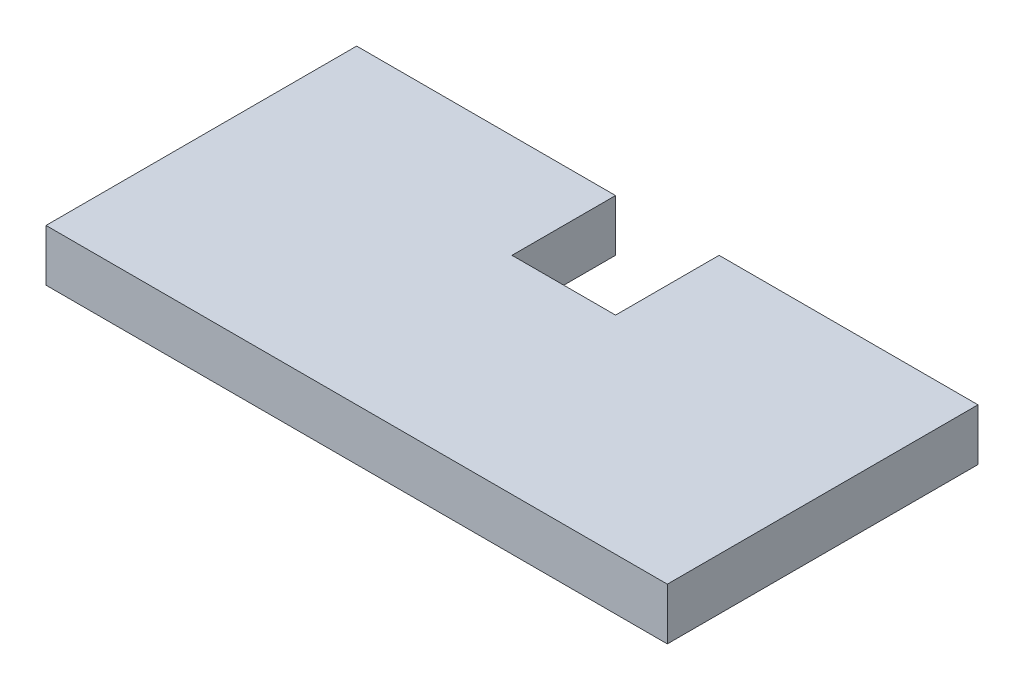
ISO-10303-21;
HEADER;
FILE_DESCRIPTION(('STEP AP214'),'2;1');
FILE_NAME('part.step','',(''),(''),'','','');
FILE_SCHEMA(('AUTOMOTIVE_DESIGN { 1 0 10303 214 1 1 1 1 }'));
ENDSEC;
DATA;
#1=APPLICATION_CONTEXT('core data for automotive mechanical design processes');
#2=APPLICATION_PROTOCOL_DEFINITION('international standard','automotive_design',2000,#1);
#3=PRODUCT_CONTEXT('',#1,'mechanical');
#4=PRODUCT('Part','Part','',(#3));
#5=PRODUCT_RELATED_PRODUCT_CATEGORY('part','',(#4));
#6=PRODUCT_DEFINITION_FORMATION('','',#4);
#7=PRODUCT_DEFINITION_CONTEXT('part definition',#1,'design');
#8=PRODUCT_DEFINITION('design','',#6,#7);
#9=PRODUCT_DEFINITION_SHAPE('','',#8);
#10=(LENGTH_UNIT() NAMED_UNIT(*) SI_UNIT(.MILLI.,.METRE.));
#11=(NAMED_UNIT(*) PLANE_ANGLE_UNIT() SI_UNIT($,.RADIAN.));
#12=(NAMED_UNIT(*) SI_UNIT($,.STERADIAN.) SOLID_ANGLE_UNIT());
#13=UNCERTAINTY_MEASURE_WITH_UNIT(LENGTH_MEASURE(1.E-05),#10,'distance_accuracy_value','');
#14=(GEOMETRIC_REPRESENTATION_CONTEXT(3) GLOBAL_UNCERTAINTY_ASSIGNED_CONTEXT((#13)) GLOBAL_UNIT_ASSIGNED_CONTEXT((#10,
#11,#12)) REPRESENTATION_CONTEXT('',''));
#15=CARTESIAN_POINT('',(0.,0.,0.));
#16=DIRECTION('',(0.,0.,1.));
#17=DIRECTION('',(1.,0.,0.));
#18=AXIS2_PLACEMENT_3D('',#15,#16,#17);
#19=CARTESIAN_POINT('',(-516.052613815904,50.,-370.540919523258));
#20=DIRECTION('',(0.,0.,-1.));
#21=DIRECTION('',(-1.,0.,0.));
#22=AXIS2_PLACEMENT_3D('',#19,#20,#21);
#23=PLANE('',#22);
#24=DIRECTION('',(1.,0.,0.));
#25=VECTOR('',#24,1.);
#26=CARTESIAN_POINT('',(-516.052613815904,50.,-370.540919523258));
#27=LINE('',#26,#25);
#28=CARTESIAN_POINT('',(-516.052613815904,50.,-370.540919523258));
#29=VERTEX_POINT('',#28);
#30=CARTESIAN_POINT('',(-266.052613815904,50.,-370.540919523258));
#31=VERTEX_POINT('',#30);
#32=EDGE_CURVE('E149',#29,#31,#27,.T.);
#33=ORIENTED_EDGE('',*,*,#32,.T.);
#34=DIRECTION('',(0.,-1.,0.));
#35=VECTOR('',#34,1.);
#36=CARTESIAN_POINT('',(-266.052613815904,50.,-370.540919523258));
#37=LINE('',#36,#35);
#38=CARTESIAN_POINT('',(-266.052613815904,0.,-370.540919523258));
#39=VERTEX_POINT('',#38);
#40=EDGE_CURVE('E119',#31,#39,#37,.T.);
#41=ORIENTED_EDGE('',*,*,#40,.T.);
#42=DIRECTION('',(1.,0.,0.));
#43=VECTOR('',#42,1.);
#44=CARTESIAN_POINT('',(-516.052613815904,0.,-370.540919523258));
#45=LINE('',#44,#43);
#46=CARTESIAN_POINT('',(-516.052613815904,0.,-370.540919523258));
#47=VERTEX_POINT('',#46);
#48=EDGE_CURVE('E143',#47,#39,#45,.T.);
#49=ORIENTED_EDGE('',*,*,#48,.F.);
#50=DIRECTION('',(0.,-1.,0.));
#51=VECTOR('',#50,1.);
#52=CARTESIAN_POINT('',(-516.052613815904,50.,-370.540919523258));
#53=LINE('',#52,#51);
#54=EDGE_CURVE('E58',#29,#47,#53,.T.);
#55=ORIENTED_EDGE('',*,*,#54,.F.);
#56=EDGE_LOOP('',(#33,#41,#49,#55));
#57=FACE_BOUND('',#56,.T.);
#58=ADVANCED_FACE('F34',(#57),#23,.T.);
#59=CARTESIAN_POINT('',(0.,50.,0.));
#60=DIRECTION('',(0.,1.,0.));
#61=DIRECTION('',(0.,0.,1.));
#62=AXIS2_PLACEMENT_3D('',#59,#60,#61);
#63=PLANE('',#62);
#64=DIRECTION('',(-1.,0.,0.));
#65=VECTOR('',#64,1.);
#66=CARTESIAN_POINT('',(-166.052613815904,50.,-270.540919523258));
#67=LINE('',#66,#65);
#68=CARTESIAN_POINT('',(-166.052613815904,50.,-270.540919523258));
#69=VERTEX_POINT('',#68);
#70=CARTESIAN_POINT('',(-266.052613815904,50.,-270.540919523258));
#71=VERTEX_POINT('',#70);
#72=EDGE_CURVE('E109',#69,#71,#67,.T.);
#73=ORIENTED_EDGE('',*,*,#72,.T.);
#74=DIRECTION('',(0.,0.,-1.));
#75=VECTOR('',#74,1.);
#76=CARTESIAN_POINT('',(-266.052613815904,50.,-270.540919523258));
#77=LINE('',#76,#75);
#78=EDGE_CURVE('E116',#71,#31,#77,.T.);
#79=ORIENTED_EDGE('',*,*,#78,.T.);
#80=ORIENTED_EDGE('',*,*,#32,.F.);
#81=DIRECTION('',(0.,0.,1.));
#82=VECTOR('',#81,1.);
#83=CARTESIAN_POINT('',(-516.052613815904,50.,-370.540919523258));
#84=LINE('',#83,#82);
#85=CARTESIAN_POINT('',(-516.052613815904,50.,-70.5409195232582));
#86=VERTEX_POINT('',#85);
#87=EDGE_CURVE('E141',#29,#86,#84,.T.);
#88=ORIENTED_EDGE('',*,*,#87,.T.);
#89=DIRECTION('',(1.,0.,0.));
#90=VECTOR('',#89,1.);
#91=CARTESIAN_POINT('',(-516.052613815904,50.,-70.5409195232582));
#92=LINE('',#91,#90);
#93=CARTESIAN_POINT('',(83.9473861840964,50.,-70.5409195232582));
#94=VERTEX_POINT('',#93);
#95=EDGE_CURVE('E84',#86,#94,#92,.T.);
#96=ORIENTED_EDGE('',*,*,#95,.T.);
#97=DIRECTION('',(0.,0.,1.));
#98=VECTOR('',#97,1.);
#99=CARTESIAN_POINT('',(83.9473861840964,50.,-370.540919523258));
#100=LINE('',#99,#98);
#101=CARTESIAN_POINT('',(83.9473861840964,50.,-370.540919523258));
#102=VERTEX_POINT('',#101);
#103=EDGE_CURVE('E145',#102,#94,#100,.T.);
#104=ORIENTED_EDGE('',*,*,#103,.F.);
#105=CARTESIAN_POINT('',(-166.052613815904,50.,-370.540919523258));
#106=VERTEX_POINT('',#105);
#107=EDGE_CURVE('E148',#106,#102,#27,.T.);
#108=ORIENTED_EDGE('',*,*,#107,.F.);
#109=DIRECTION('',(0.,0.,-1.));
#110=VECTOR('',#109,1.);
#111=CARTESIAN_POINT('',(-166.052613815904,50.,-270.540919523258));
#112=LINE('',#111,#110);
#113=EDGE_CURVE('E128',#69,#106,#112,.T.);
#114=ORIENTED_EDGE('',*,*,#113,.F.);
#115=EDGE_LOOP('',(#73,#79,#80,#88,#96,#104,#108,#114));
#116=FACE_BOUND('',#115,.T.);
#117=ADVANCED_FACE('F126',(#116),#63,.T.);
#118=CARTESIAN_POINT('',(0.,0.,0.));
#119=DIRECTION('',(0.,1.,0.));
#120=DIRECTION('',(0.,0.,1.));
#121=AXIS2_PLACEMENT_3D('',#118,#119,#120);
#122=PLANE('',#121);
#123=DIRECTION('',(0.,0.,-1.));
#124=VECTOR('',#123,1.);
#125=CARTESIAN_POINT('',(-266.052613815904,0.,-270.540919523258));
#126=LINE('',#125,#124);
#127=CARTESIAN_POINT('',(-266.052613815904,0.,-270.540919523258));
#128=VERTEX_POINT('',#127);
#129=EDGE_CURVE('E123',#128,#39,#126,.T.);
#130=ORIENTED_EDGE('',*,*,#129,.F.);
#131=DIRECTION('',(-1.,0.,0.));
#132=VECTOR('',#131,1.);
#133=CARTESIAN_POINT('',(-166.052613815904,0.,-270.540919523258));
#134=LINE('',#133,#132);
#135=CARTESIAN_POINT('',(-166.052613815904,0.,-270.540919523258));
#136=VERTEX_POINT('',#135);
#137=EDGE_CURVE('E111',#136,#128,#134,.T.);
#138=ORIENTED_EDGE('',*,*,#137,.F.);
#139=DIRECTION('',(0.,0.,-1.));
#140=VECTOR('',#139,1.);
#141=CARTESIAN_POINT('',(-166.052613815904,0.,-270.540919523258));
#142=LINE('',#141,#140);
#143=CARTESIAN_POINT('',(-166.052613815904,0.,-370.540919523258));
#144=VERTEX_POINT('',#143);
#145=EDGE_CURVE('E137',#136,#144,#142,.T.);
#146=ORIENTED_EDGE('',*,*,#145,.T.);
#147=CARTESIAN_POINT('',(83.9473861840964,0.,-370.540919523258));
#148=VERTEX_POINT('',#147);
#149=EDGE_CURVE('E158',#144,#148,#45,.T.);
#150=ORIENTED_EDGE('',*,*,#149,.T.);
#151=DIRECTION('',(0.,0.,1.));
#152=VECTOR('',#151,1.);
#153=CARTESIAN_POINT('',(83.9473861840964,0.,-370.540919523258));
#154=LINE('',#153,#152);
#155=CARTESIAN_POINT('',(83.9473861840964,0.,-70.5409195232582));
#156=VERTEX_POINT('',#155);
#157=EDGE_CURVE('E155',#148,#156,#154,.T.);
#158=ORIENTED_EDGE('',*,*,#157,.T.);
#159=DIRECTION('',(1.,0.,0.));
#160=VECTOR('',#159,1.);
#161=CARTESIAN_POINT('',(-516.052613815904,0.,-70.5409195232582));
#162=LINE('',#161,#160);
#163=CARTESIAN_POINT('',(-516.052613815904,0.,-70.5409195232582));
#164=VERTEX_POINT('',#163);
#165=EDGE_CURVE('E152',#164,#156,#162,.T.);
#166=ORIENTED_EDGE('',*,*,#165,.F.);
#167=DIRECTION('',(0.,0.,1.));
#168=VECTOR('',#167,1.);
#169=CARTESIAN_POINT('',(-516.052613815904,0.,-370.540919523258));
#170=LINE('',#169,#168);
#171=EDGE_CURVE('E122',#47,#164,#170,.T.);
#172=ORIENTED_EDGE('',*,*,#171,.F.);
#173=ORIENTED_EDGE('',*,*,#48,.T.);
#174=EDGE_LOOP('',(#130,#138,#146,#150,#158,#166,#172,#173));
#175=FACE_BOUND('',#174,.T.);
#176=ADVANCED_FACE('F172',(#175),#122,.F.);
#177=CARTESIAN_POINT('',(-516.052613815904,50.,-370.540919523258));
#178=DIRECTION('',(1.,0.,0.));
#179=DIRECTION('',(0.,0.,-1.));
#180=AXIS2_PLACEMENT_3D('',#177,#178,#179);
#181=PLANE('',#180);
#182=ORIENTED_EDGE('',*,*,#171,.T.);
#183=DIRECTION('',(0.,-1.,0.));
#184=VECTOR('',#183,1.);
#185=CARTESIAN_POINT('',(-516.052613815904,50.,-70.5409195232582));
#186=LINE('',#185,#184);
#187=EDGE_CURVE('E11',#86,#164,#186,.T.);
#188=ORIENTED_EDGE('',*,*,#187,.F.);
#189=ORIENTED_EDGE('',*,*,#87,.F.);
#190=ORIENTED_EDGE('',*,*,#54,.T.);
#191=EDGE_LOOP('',(#182,#188,#189,#190));
#192=FACE_BOUND('',#191,.T.);
#193=ADVANCED_FACE('F36',(#192),#181,.F.);
#194=CARTESIAN_POINT('',(-516.052613815904,50.,-70.5409195232582));
#195=DIRECTION('',(0.,0.,-1.));
#196=DIRECTION('',(-1.,0.,0.));
#197=AXIS2_PLACEMENT_3D('',#194,#195,#196);
#198=PLANE('',#197);
#199=ORIENTED_EDGE('',*,*,#165,.T.);
#200=DIRECTION('',(0.,-1.,0.));
#201=VECTOR('',#200,1.);
#202=CARTESIAN_POINT('',(83.9473861840964,50.,-70.5409195232582));
#203=LINE('',#202,#201);
#204=EDGE_CURVE('E42',#94,#156,#203,.T.);
#205=ORIENTED_EDGE('',*,*,#204,.F.);
#206=ORIENTED_EDGE('',*,*,#95,.F.);
#207=ORIENTED_EDGE('',*,*,#187,.T.);
#208=EDGE_LOOP('',(#199,#205,#206,#207));
#209=FACE_BOUND('',#208,.T.);
#210=ADVANCED_FACE('F169',(#209),#198,.F.);
#211=CARTESIAN_POINT('',(83.9473861840964,50.,-370.540919523258));
#212=DIRECTION('',(1.,0.,0.));
#213=DIRECTION('',(0.,0.,-1.));
#214=AXIS2_PLACEMENT_3D('',#211,#212,#213);
#215=PLANE('',#214);
#216=ORIENTED_EDGE('',*,*,#157,.F.);
#217=DIRECTION('',(0.,-1.,0.));
#218=VECTOR('',#217,1.);
#219=CARTESIAN_POINT('',(83.9473861840964,50.,-370.540919523258));
#220=LINE('',#219,#218);
#221=EDGE_CURVE('E162',#102,#148,#220,.T.);
#222=ORIENTED_EDGE('',*,*,#221,.F.);
#223=ORIENTED_EDGE('',*,*,#103,.T.);
#224=ORIENTED_EDGE('',*,*,#204,.T.);
#225=EDGE_LOOP('',(#216,#222,#223,#224));
#226=FACE_BOUND('',#225,.T.);
#227=ADVANCED_FACE('F166',(#226),#215,.T.);
#228=DIRECTION('',(0.,-1.,0.));
#229=VECTOR('',#228,1.);
#230=CARTESIAN_POINT('',(-166.052613815904,50.,-370.540919523258));
#231=LINE('',#230,#229);
#232=EDGE_CURVE('E129',#106,#144,#231,.T.);
#233=ORIENTED_EDGE('',*,*,#232,.F.);
#234=ORIENTED_EDGE('',*,*,#107,.T.);
#235=ORIENTED_EDGE('',*,*,#221,.T.);
#236=ORIENTED_EDGE('',*,*,#149,.F.);
#237=EDGE_LOOP('',(#233,#234,#235,#236));
#238=FACE_BOUND('',#237,.T.);
#239=ADVANCED_FACE('F176',(#238),#23,.T.);
#240=CARTESIAN_POINT('',(-266.052613815904,50.,-270.540919523258));
#241=DIRECTION('',(1.,0.,0.));
#242=DIRECTION('',(0.,1.,0.));
#243=AXIS2_PLACEMENT_3D('',#240,#241,#242);
#244=PLANE('',#243);
#245=ORIENTED_EDGE('',*,*,#40,.F.);
#246=ORIENTED_EDGE('',*,*,#78,.F.);
#247=DIRECTION('',(0.,-1.,0.));
#248=VECTOR('',#247,1.);
#249=CARTESIAN_POINT('',(-266.052613815904,50.,-270.540919523258));
#250=LINE('',#249,#248);
#251=EDGE_CURVE('E105',#71,#128,#250,.T.);
#252=ORIENTED_EDGE('',*,*,#251,.T.);
#253=ORIENTED_EDGE('',*,*,#129,.T.);
#254=EDGE_LOOP('',(#245,#246,#252,#253));
#255=FACE_BOUND('',#254,.T.);
#256=ADVANCED_FACE('F117',(#255),#244,.T.);
#257=CARTESIAN_POINT('',(-166.052613815904,50.,-270.540919523258));
#258=DIRECTION('',(1.,0.,0.));
#259=DIRECTION('',(0.,0.,-1.));
#260=AXIS2_PLACEMENT_3D('',#257,#258,#259);
#261=PLANE('',#260);
#262=ORIENTED_EDGE('',*,*,#232,.T.);
#263=ORIENTED_EDGE('',*,*,#145,.F.);
#264=DIRECTION('',(0.,-1.,0.));
#265=VECTOR('',#264,1.);
#266=CARTESIAN_POINT('',(-166.052613815904,50.,-270.540919523258));
#267=LINE('',#266,#265);
#268=EDGE_CURVE('E49',#69,#136,#267,.T.);
#269=ORIENTED_EDGE('',*,*,#268,.F.);
#270=ORIENTED_EDGE('',*,*,#113,.T.);
#271=EDGE_LOOP('',(#262,#263,#269,#270));
#272=FACE_BOUND('',#271,.T.);
#273=ADVANCED_FACE('F190',(#272),#261,.F.);
#274=CARTESIAN_POINT('',(0.,0.,-270.540919523258));
#275=DIRECTION('',(0.,0.,1.));
#276=DIRECTION('',(1.,0.,0.));
#277=AXIS2_PLACEMENT_3D('',#274,#275,#276);
#278=PLANE('',#277);
#279=ORIENTED_EDGE('',*,*,#72,.F.);
#280=ORIENTED_EDGE('',*,*,#268,.T.);
#281=ORIENTED_EDGE('',*,*,#137,.T.);
#282=ORIENTED_EDGE('',*,*,#251,.F.);
#283=EDGE_LOOP('',(#279,#280,#281,#282));
#284=FACE_BOUND('',#283,.T.);
#285=ADVANCED_FACE('F107',(#284),#278,.F.);
#286=CLOSED_SHELL('',(#58,#117,#176,#193,#210,#227,#239,#256,#273,#285));
#287=MANIFOLD_SOLID_BREP('B2',#286);
#288=ADVANCED_BREP_SHAPE_REPRESENTATION('',(#18,#287),#14);
#289=SHAPE_DEFINITION_REPRESENTATION(#9,#288);
ENDSEC;
END-ISO-10303-21;
